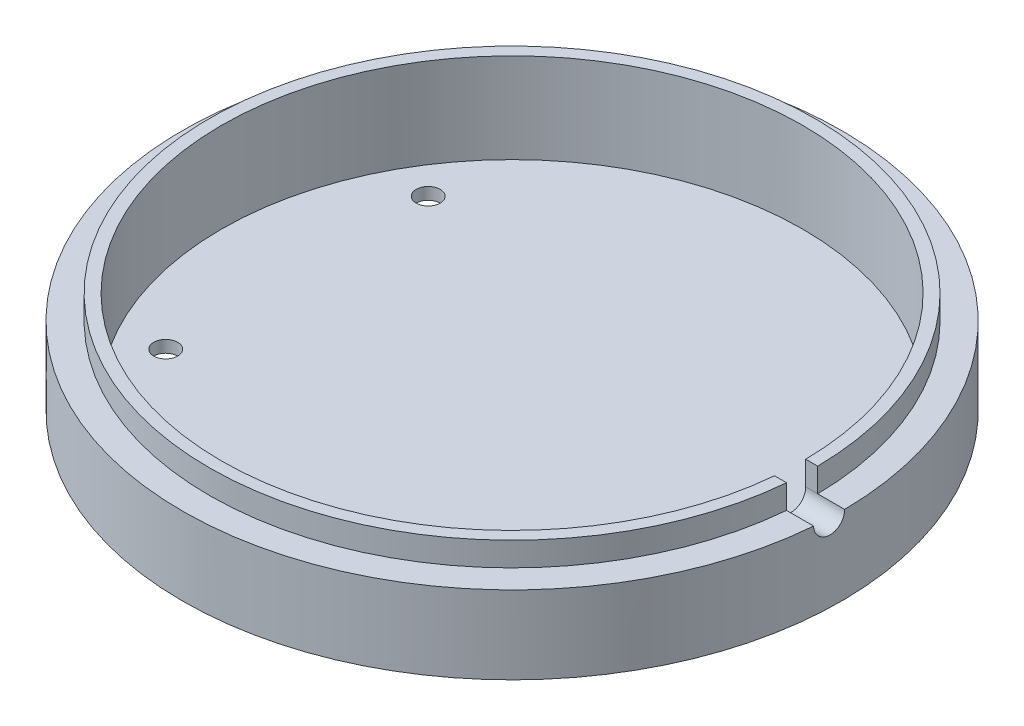
ISO-10303-21;
HEADER;
FILE_DESCRIPTION(('STEP AP214'),'2;1');
FILE_NAME('part.step','',(''),(''),'','','');
FILE_SCHEMA(('AUTOMOTIVE_DESIGN { 1 0 10303 214 1 1 1 1 }'));
ENDSEC;
DATA;
#1=APPLICATION_CONTEXT('core data for automotive mechanical design processes');
#2=APPLICATION_PROTOCOL_DEFINITION('international standard','automotive_design',2000,#1);
#3=PRODUCT_CONTEXT('',#1,'mechanical');
#4=PRODUCT('Part','Part','',(#3));
#5=PRODUCT_RELATED_PRODUCT_CATEGORY('part','',(#4));
#6=PRODUCT_DEFINITION_FORMATION('','',#4);
#7=PRODUCT_DEFINITION_CONTEXT('part definition',#1,'design');
#8=PRODUCT_DEFINITION('design','',#6,#7);
#9=PRODUCT_DEFINITION_SHAPE('','',#8);
#10=(LENGTH_UNIT() NAMED_UNIT(*) SI_UNIT(.MILLI.,.METRE.));
#11=(NAMED_UNIT(*) PLANE_ANGLE_UNIT() SI_UNIT($,.RADIAN.));
#12=(NAMED_UNIT(*) SI_UNIT($,.STERADIAN.) SOLID_ANGLE_UNIT());
#13=UNCERTAINTY_MEASURE_WITH_UNIT(LENGTH_MEASURE(1.E-05),#10,'distance_accuracy_value','');
#14=(GEOMETRIC_REPRESENTATION_CONTEXT(3) GLOBAL_UNCERTAINTY_ASSIGNED_CONTEXT((#13)) GLOBAL_UNIT_ASSIGNED_CONTEXT((#10,
#11,#12)) REPRESENTATION_CONTEXT('',''));
#15=CARTESIAN_POINT('',(0.,0.,0.));
#16=DIRECTION('',(0.,0.,1.));
#17=DIRECTION('',(1.,0.,0.));
#18=AXIS2_PLACEMENT_3D('',#15,#16,#17);
#19=CARTESIAN_POINT('',(0.,17.,0.));
#20=DIRECTION('',(0.,-1.,0.));
#21=DIRECTION('',(0.,0.,-1.));
#22=AXIS2_PLACEMENT_3D('',#19,#20,#21);
#23=CYLINDRICAL_SURFACE('',#22,50.5);
#24=DIRECTION('',(0.,-1.,0.));
#25=VECTOR('',#24,1.);
#26=CARTESIAN_POINT('',(50.4975246918104,17.,-0.500000000000002));
#27=LINE('',#26,#25);
#28=CARTESIAN_POINT('',(50.4975246918104,17.,-0.500000000000002));
#29=VERTEX_POINT('',#28);
#30=CARTESIAN_POINT('',(50.4975246918104,13.,-0.500000000000002));
#31=VERTEX_POINT('',#30);
#32=EDGE_CURVE('E106',#29,#31,#27,.T.);
#33=ORIENTED_EDGE('',*,*,#32,.T.);
#34=CARTESIAN_POINT('',(0.,13.,0.));
#35=DIRECTION('',(0.,1.,0.));
#36=DIRECTION('',(0.,0.,1.));
#37=AXIS2_PLACEMENT_3D('',#34,#35,#36);
#38=CIRCLE('',#37,50.5);
#39=CARTESIAN_POINT('',(50.2991053598372,13.,4.5));
#40=VERTEX_POINT('',#39);
#41=EDGE_CURVE('E119',#31,#40,#38,.T.);
#42=ORIENTED_EDGE('',*,*,#41,.T.);
#43=DIRECTION('',(0.,-1.,0.));
#44=VECTOR('',#43,1.);
#45=CARTESIAN_POINT('',(50.2991053598372,17.,4.5));
#46=LINE('',#45,#44);
#47=CARTESIAN_POINT('',(50.2991053598372,17.,4.5));
#48=VERTEX_POINT('',#47);
#49=EDGE_CURVE('E122',#40,#48,#46,.F.);
#50=ORIENTED_EDGE('',*,*,#49,.T.);
#51=CARTESIAN_POINT('',(0.,17.,0.));
#52=DIRECTION('',(0.,1.,0.));
#53=DIRECTION('',(0.,0.,1.));
#54=AXIS2_PLACEMENT_3D('',#51,#52,#53);
#55=CIRCLE('',#54,50.5);
#56=EDGE_CURVE('E121',#29,#48,#55,.T.);
#57=ORIENTED_EDGE('',*,*,#56,.F.);
#58=EDGE_LOOP('',(#33,#42,#50,#57));
#59=FACE_BOUND('',#58,.T.);
#60=ADVANCED_FACE('F36',(#59),#23,.T.);
#61=CARTESIAN_POINT('',(0.,2.,0.));
#62=DIRECTION('',(0.,1.,0.));
#63=DIRECTION('',(0.,0.,1.));
#64=AXIS2_PLACEMENT_3D('',#61,#62,#63);
#65=CYLINDRICAL_SURFACE('',#64,48.5);
#66=CARTESIAN_POINT('',(0.,2.,0.));
#67=DIRECTION('',(0.,1.,0.));
#68=DIRECTION('',(0.,0.,1.));
#69=AXIS2_PLACEMENT_3D('',#66,#67,#68);
#70=CIRCLE('',#69,48.5);
#71=CARTESIAN_POINT('',(0.,2.,48.5));
#72=VERTEX_POINT('',#71);
#73=EDGE_CURVE('E203',#72,#72,#70,.T.);
#74=ORIENTED_EDGE('',*,*,#73,.F.);
#75=EDGE_LOOP('',(#74));
#76=FACE_BOUND('',#75,.T.);
#77=DIRECTION('',(0.,1.,0.));
#78=VECTOR('',#77,1.);
#79=CARTESIAN_POINT('',(48.4974226119286,2.,-0.500000000000002));
#80=LINE('',#79,#78);
#81=CARTESIAN_POINT('',(48.4974226119286,17.,-0.500000000000002));
#82=VERTEX_POINT('',#81);
#83=CARTESIAN_POINT('',(48.4974226119286,13.,-0.500000000000002));
#84=VERTEX_POINT('',#83);
#85=EDGE_CURVE('E52',#82,#84,#80,.F.);
#86=ORIENTED_EDGE('',*,*,#85,.F.);
#87=CARTESIAN_POINT('',(0.,17.,0.));
#88=DIRECTION('',(0.,1.,0.));
#89=DIRECTION('',(0.,0.,1.));
#90=AXIS2_PLACEMENT_3D('',#87,#88,#89);
#91=CIRCLE('',#90,48.5);
#92=CARTESIAN_POINT('',(48.2907858705985,17.,4.5));
#93=VERTEX_POINT('',#92);
#94=EDGE_CURVE('E202',#82,#93,#91,.T.);
#95=ORIENTED_EDGE('',*,*,#94,.T.);
#96=DIRECTION('',(0.,1.,0.));
#97=VECTOR('',#96,1.);
#98=CARTESIAN_POINT('',(48.2907858705985,2.,4.5));
#99=LINE('',#98,#97);
#100=CARTESIAN_POINT('',(48.2907858705985,13.,4.5));
#101=VERTEX_POINT('',#100);
#102=EDGE_CURVE('E209',#101,#93,#99,.T.);
#103=ORIENTED_EDGE('',*,*,#102,.F.);
#104=CARTESIAN_POINT('',(48.2907858705985,13.,4.5));
#105=CARTESIAN_POINT('',(48.2907869983494,13.1400458171869,4.49999376397492));
#106=CARTESIAN_POINT('',(48.2918907021441,13.2801910099482,4.48819215089214));
#107=CARTESIAN_POINT('',(48.2962265607347,13.5566077401989,4.4412873276228));
#108=CARTESIAN_POINT('',(48.299461222655,13.6928745173943,4.40615666985574));
#109=CARTESIAN_POINT('',(48.30781305381,13.9574830838289,4.31362296534251));
#110=CARTESIAN_POINT('',(48.3129291088612,14.0858295111654,4.25623309966852));
#111=CARTESIAN_POINT('',(48.3246649170977,14.3310271215299,4.12084400911396));
#112=CARTESIAN_POINT('',(48.3312843306607,14.4478808923225,4.04284943837562));
#113=CARTESIAN_POINT('',(48.3455727644471,14.6671466057018,3.86823785388425));
#114=CARTESIAN_POINT('',(48.3532444122863,14.769521048206,3.77157396480461));
#115=CARTESIAN_POINT('',(48.3690986986214,14.9566145053684,3.56247969951368));
#116=CARTESIAN_POINT('',(48.3772813654191,15.0413325410319,3.45004844962752));
#117=CARTESIAN_POINT('',(48.3936565181206,15.1909744777779,3.21220200678276));
#118=CARTESIAN_POINT('',(48.4018489525332,15.2558345914832,3.08674667068886));
#119=CARTESIAN_POINT('',(48.4177319582093,15.3635543242681,2.82669160765621));
#120=CARTESIAN_POINT('',(48.4254225292327,15.4064139328293,2.69209187634552));
#121=CARTESIAN_POINT('',(48.4399051936473,15.4689043706511,2.417534835683));
#122=CARTESIAN_POINT('',(48.4466971541605,15.4885317679564,2.27757673792359));
#123=CARTESIAN_POINT('',(48.4591022764614,15.5039616585219,1.99630167778583));
#124=CARTESIAN_POINT('',(48.4647154547101,15.4997644845005,1.85498473441174));
#125=CARTESIAN_POINT('',(48.4746109420872,15.4676743516801,1.5753210531184));
#126=CARTESIAN_POINT('',(48.4788960209758,15.4398311669001,1.43696870154054));
#127=CARTESIAN_POINT('',(48.4861492064929,15.3612883557515,1.16687538695754));
#128=CARTESIAN_POINT('',(48.4891173235441,15.3105889102779,1.03513437163639));
#129=CARTESIAN_POINT('',(48.4938564158521,15.1878654257406,0.782227629154967));
#130=CARTESIAN_POINT('',(48.495629286958,15.115875419098,0.661045421218322));
#131=CARTESIAN_POINT('',(48.498206741385,14.9525810694077,0.432468418288963));
#132=CARTESIAN_POINT('',(48.499011324808,14.8612767283949,0.32507362184364));
#133=CARTESIAN_POINT('',(48.4999346579205,14.6619410320731,0.12711908176177));
#134=CARTESIAN_POINT('',(48.5000533864411,14.5539091605753,0.0365598578379977));
#135=CARTESIAN_POINT('',(48.499906157839,14.3241840867754,-0.125151211783195));
#136=CARTESIAN_POINT('',(48.4996401995591,14.2024908433771,-0.196302999096772));
#137=CARTESIAN_POINT('',(48.4990004965028,13.948819025278,-0.317217340452529));
#138=CARTESIAN_POINT('',(48.4986266894845,13.8168345434546,-0.36696750170044));
#139=CARTESIAN_POINT('',(48.4979864937392,13.5463870187929,-0.443606993328551));
#140=CARTESIAN_POINT('',(48.4977201050525,13.4079239735362,-0.470496315174723));
#141=CARTESIAN_POINT('',(48.4974182723465,13.1284282204978,-0.500653081529819));
#142=CARTESIAN_POINT('',(48.4973828618745,12.9873951424285,-0.503917094716511));
#143=CARTESIAN_POINT('',(48.4975584254694,12.7067828935153,-0.486721434199493));
#144=CARTESIAN_POINT('',(48.4977693996442,12.567203723308,-0.466261750110578));
#145=CARTESIAN_POINT('',(48.4983427516081,12.2934673149327,-0.402200996684137));
#146=CARTESIAN_POINT('',(48.4987051232031,12.1593098551962,-0.358600874056131));
#147=CARTESIAN_POINT('',(48.4993887585098,11.900218142056,-0.249497259290456));
#148=CARTESIAN_POINT('',(48.4997100221737,11.7752838993615,-0.183993741721003));
#149=CARTESIAN_POINT('',(48.5000474021985,11.5381788853034,-0.0329385307565904));
#150=CARTESIAN_POINT('',(48.5000635036592,11.4260087374432,0.0526141413801727));
#151=CARTESIAN_POINT('',(48.4994910988645,11.2176245498922,0.241336413439971));
#152=CARTESIAN_POINT('',(48.4989025938076,11.1214104785715,0.344505978440134));
#153=CARTESIAN_POINT('',(48.4968287410508,10.9476978141345,0.565495577012816));
#154=CARTESIAN_POINT('',(48.4953436597369,10.8701936715919,0.683311250755987));
#155=CARTESIAN_POINT('',(48.4912346809443,10.7360639585669,0.93026297259272));
#156=CARTESIAN_POINT('',(48.4886107914092,10.679438242453,1.05939894171694));
#157=CARTESIAN_POINT('',(48.4820730240634,10.5886917872186,1.32523528226841));
#158=CARTESIAN_POINT('',(48.4781598905006,10.5545580980456,1.46193125170266));
#159=CARTESIAN_POINT('',(48.4690092607255,10.5096950340537,1.73906758683945));
#160=CARTESIAN_POINT('',(48.4637717613087,10.498965715867,1.87950796160161));
#161=CARTESIAN_POINT('',(48.4520717499067,10.5011919939973,2.16020446790712));
#162=CARTESIAN_POINT('',(48.4456087518019,10.5141570068547,2.3004605040222));
#163=CARTESIAN_POINT('',(48.4316983596991,10.5633976107184,2.57676891696635));
#164=CARTESIAN_POINT('',(48.4242509511942,10.5996735452789,2.71282123181034));
#165=CARTESIAN_POINT('',(48.4087193758759,10.694588252759,2.97715748209569));
#166=CARTESIAN_POINT('',(48.4006339657292,10.753271591844,3.1054253419594));
#167=CARTESIAN_POINT('',(48.3843021994849,10.8913281673662,3.35028000325933));
#168=CARTESIAN_POINT('',(48.3760558472265,10.9707009108185,3.46686708293237));
#169=CARTESIAN_POINT('',(48.3599101143469,11.148048116964,3.68525774724829));
#170=CARTESIAN_POINT('',(48.3520113195286,11.2460526076055,3.78703699279143));
#171=CARTESIAN_POINT('',(48.3371102229767,11.4578507391222,3.9727165698393));
#172=CARTESIAN_POINT('',(48.3301081358122,11.5716481454915,4.05661262533356));
#173=CARTESIAN_POINT('',(48.3175076680898,11.81170309031,4.20403864436552));
#174=CARTESIAN_POINT('',(48.3119083742691,11.9379524471318,4.26758186578422));
#175=CARTESIAN_POINT('',(48.3025281377223,12.1992990127922,4.37247933629053));
#176=CARTESIAN_POINT('',(48.2987450062006,12.334385347175,4.41386030179198));
#177=CARTESIAN_POINT('',(48.29428496795,12.5586043713275,4.46232763393178));
#178=CARTESIAN_POINT('',(48.2929767974885,12.646269120631,4.4764364071059));
#179=CARTESIAN_POINT('',(48.2912268928844,12.8226092891764,4.4952745515513));
#180=CARTESIAN_POINT('',(48.2907851561984,12.9112847054506,4.50000395035577));
#181=CARTESIAN_POINT('',(48.2907858705985,13.,4.5));
#182=B_SPLINE_CURVE_WITH_KNOTS('',3,(#104,#105,#106,#107,#108,#109,#110,#111,#112,#113,#114,
#115,#116,#117,#118,#119,#120,#121,#122,#123,#124,#125,#126,#127,#128,#129,#130,#131,#132,#133,
#134,#135,#136,#137,#138,#139,#140,#141,#142,#143,#144,#145,#146,#147,#148,#149,#150,#151,#152,
#153,#154,#155,#156,#157,#158,#159,#160,#161,#162,#163,#164,#165,#166,#167,#168,#169,#170,#171,
#172,#173,#174,#175,#176,#177,#178,#179,#180,#181),.UNSPECIFIED.,.T.,.F.,(4,2,2,2,2,2,2,2,2,2,2,
2,2,2,2,2,2,2,2,2,2,2,2,2,2,2,2,2,2,2,2,2,2,2,2,2,2,2,4),(0.,0.419812985383906,
0.840120775190917,1.26018005347148,1.68014453075716,2.10117750384078,2.5222338157302,
2.94462878283616,3.36702395189101,3.78948151106725,4.21193317048901,4.6334977818766,
5.05505905686491,5.47595008584213,5.89684107047528,6.31774504582275,6.73865028737149,
7.15979893068439,7.5809477312134,8.00215769785337,8.42336784888087,8.84456076890713,
9.26575417797741,9.68696815277783,10.1081812925938,10.5292693452863,10.9503544607408,
11.3711969190864,11.7920403957547,12.213051159333,12.6340681278752,13.0559268573373,
13.4777755357113,13.9003099423644,14.3229452672459,14.7453047239898,15.1671538773262,
15.4330950009672,15.6990353439358),.UNSPECIFIED.);
#183=EDGE_CURVE('E149',#84,#101,#182,.T.);
#184=ORIENTED_EDGE('',*,*,#183,.F.);
#185=EDGE_LOOP('',(#86,#95,#103,#184));
#186=FACE_BOUND('',#185,.T.);
#187=ADVANCED_FACE('F157',(#76,#186),#65,.F.);
#188=CARTESIAN_POINT('',(0.,17.,0.));
#189=DIRECTION('',(0.,1.,0.));
#190=DIRECTION('',(0.,0.,1.));
#191=AXIS2_PLACEMENT_3D('',#188,#189,#190);
#192=PLANE('',#191);
#193=ORIENTED_EDGE('',*,*,#94,.F.);
#194=DIRECTION('',(1.,0.,0.));
#195=VECTOR('',#194,1.);
#196=CARTESIAN_POINT('',(0.,17.,-0.500000000000002));
#197=LINE('',#196,#195);
#198=EDGE_CURVE('E212',#82,#29,#197,.T.);
#199=ORIENTED_EDGE('',*,*,#198,.T.);
#200=ORIENTED_EDGE('',*,*,#56,.T.);
#201=DIRECTION('',(-1.,0.,0.));
#202=VECTOR('',#201,1.);
#203=CARTESIAN_POINT('',(0.,17.,4.5));
#204=LINE('',#203,#202);
#205=EDGE_CURVE('E213',#48,#93,#204,.T.);
#206=ORIENTED_EDGE('',*,*,#205,.T.);
#207=EDGE_LOOP('',(#193,#199,#200,#206));
#208=FACE_BOUND('',#207,.T.);
#209=ADVANCED_FACE('F165',(#208),#192,.T.);
#210=CARTESIAN_POINT('',(56.,13.,2.));
#211=DIRECTION('',(-1.,0.,0.));
#212=DIRECTION('',(0.,0.,1.));
#213=AXIS2_PLACEMENT_3D('',#210,#211,#212);
#214=CYLINDRICAL_SURFACE('',#213,2.5);
#215=DIRECTION('',(-1.,0.,0.));
#216=VECTOR('',#215,1.);
#217=CARTESIAN_POINT('',(56.,13.,-0.500000000000002));
#218=LINE('',#217,#216);
#219=CARTESIAN_POINT('',(54.9977272257682,13.,-0.500000000000002));
#220=VERTEX_POINT('',#219);
#221=EDGE_CURVE('E125',#31,#220,#218,.F.);
#222=ORIENTED_EDGE('',*,*,#221,.F.);
#223=DIRECTION('',(-1.,0.,0.));
#224=VECTOR('',#223,1.);
#225=CARTESIAN_POINT('',(55.001,13.,-0.500000000000002));
#226=LINE('',#225,#224);
#227=EDGE_CURVE('E103',#31,#84,#226,.T.);
#228=ORIENTED_EDGE('',*,*,#227,.T.);
#229=ORIENTED_EDGE('',*,*,#183,.T.);
#230=DIRECTION('',(-1.,0.,0.));
#231=VECTOR('',#230,1.);
#232=CARTESIAN_POINT('',(55.001,13.,4.5));
#233=LINE('',#232,#231);
#234=EDGE_CURVE('E112',#40,#101,#233,.T.);
#235=ORIENTED_EDGE('',*,*,#234,.F.);
#236=DIRECTION('',(-1.,0.,0.));
#237=VECTOR('',#236,1.);
#238=CARTESIAN_POINT('',(56.,13.,4.5));
#239=LINE('',#238,#237);
#240=CARTESIAN_POINT('',(54.8155999693518,13.,4.5));
#241=VERTEX_POINT('',#240);
#242=EDGE_CURVE('E132',#241,#40,#239,.T.);
#243=ORIENTED_EDGE('',*,*,#242,.F.);
#244=CARTESIAN_POINT('',(54.8155999693518,13.,4.5));
#245=CARTESIAN_POINT('',(54.8155983995871,12.9298297064675,4.50000686898044));
#246=CARTESIAN_POINT('',(54.8158424708288,12.8596627290745,4.49704571114808));
#247=CARTESIAN_POINT('',(54.8168102127968,12.7198326668636,4.48524049891385));
#248=CARTESIAN_POINT('',(54.817533855794,12.6501695531472,4.4763967846463));
#249=CARTESIAN_POINT('',(54.8194482712985,12.511893308751,4.45288930525375));
#250=CARTESIAN_POINT('',(54.8206386579611,12.4432793593086,4.43823034732211));
#251=CARTESIAN_POINT('',(54.8234623014956,12.3075513393883,4.40321324488677));
#252=CARTESIAN_POINT('',(54.8250955538865,12.2404372537414,4.38285515805018));
#253=CARTESIAN_POINT('',(54.8306186752923,12.0420000555667,4.31340330285218));
#254=CARTESIAN_POINT('',(54.8351328519614,11.9135165507092,4.25592074868602));
#255=CARTESIAN_POINT('',(54.8454876976989,11.6681199865616,4.12032400604888));
#256=CARTESIAN_POINT('',(54.8513281602884,11.5512051303029,4.04221302874706));
#257=CARTESIAN_POINT('',(54.8639319033103,11.331895926801,3.86738298659584));
#258=CARTESIAN_POINT('',(54.8706969246008,11.2295297333087,3.77062867374373));
#259=CARTESIAN_POINT('',(54.8846778692196,11.0424664608524,3.56133585574425));
#260=CARTESIAN_POINT('',(54.8918938646935,10.9577722184538,3.4487948214746));
#261=CARTESIAN_POINT('',(54.9063282778711,10.8082614167667,3.21081585107867));
#262=CARTESIAN_POINT('',(54.9135466584752,10.7434938934282,3.08534709817857));
#263=CARTESIAN_POINT('',(54.927539858995,10.6359607438593,2.82529691658091));
#264=CARTESIAN_POINT('',(54.9343147061477,10.5931937654913,2.69071604848275));
#265=CARTESIAN_POINT('',(54.9470719937661,10.5308776725196,2.41622598188404));
#266=CARTESIAN_POINT('',(54.9530543300848,10.5113316067874,2.27631608617846));
#267=CARTESIAN_POINT('',(54.9639803254768,10.4960436611623,1.99515819421601));
#268=CARTESIAN_POINT('',(54.9689239704275,10.5003021049075,1.85391017979258));
#269=CARTESIAN_POINT('',(54.9776408652268,10.5324955513434,1.57433731308931));
#270=CARTESIAN_POINT('',(54.981416024597,10.5603916438506,1.43600803954293));
#271=CARTESIAN_POINT('',(54.9878054829992,10.6390301187327,1.16597601403474));
#272=CARTESIAN_POINT('',(54.9904197940988,10.6897722636034,1.03427319320114));
#273=CARTESIAN_POINT('',(54.9945942782886,10.8125918179653,0.781402844326326));
#274=CARTESIAN_POINT('',(54.9961557220252,10.8846433586514,0.660222771480109));
#275=CARTESIAN_POINT('',(54.9984249148587,11.0480584929222,0.431670323347613));
#276=CARTESIAN_POINT('',(54.9991327047969,11.1394211623602,0.324297287711839));
#277=CARTESIAN_POINT('',(54.9999439314467,11.338855132503,0.126412340330451));
#278=CARTESIAN_POINT('',(55.0000474330046,11.4469246391163,0.0358986204176465));
#279=CARTESIAN_POINT('',(54.9999158777237,11.6767601403725,-0.125741007440721));
#280=CARTESIAN_POINT('',(54.9996807141877,11.7985304403338,-0.196860796893223));
#281=CARTESIAN_POINT('',(54.9991156728593,12.0523860507389,-0.317720039174873));
#282=CARTESIAN_POINT('',(54.9987856957761,12.1844820683789,-0.367436941367662));
#283=CARTESIAN_POINT('',(54.9982220247451,12.4550443456375,-0.443915443368607));
#284=CARTESIAN_POINT('',(54.9979881857985,12.5935006591629,-0.470711679356618));
#285=CARTESIAN_POINT('',(54.997813076319,12.7774087930417,-0.490473167770539));
#286=CARTESIAN_POINT('',(54.9977810379513,12.8218913510113,-0.494047607667849));
#287=CARTESIAN_POINT('',(54.9977381353444,12.9109098931291,-0.498807772845912));
#288=CARTESIAN_POINT('',(54.997727235937,12.9554456649861,-0.499997465672938));
#289=CARTESIAN_POINT('',(54.9977272257682,13.,-0.500000000000002));
#290=B_SPLINE_CURVE_WITH_KNOTS('',3,(#244,#245,#246,#247,#248,#249,#250,#251,#252,#253,#254,
#255,#256,#257,#258,#259,#260,#261,#262,#263,#264,#265,#266,#267,#268,#269,#270,#271,#272,#273,
#274,#275,#276,#277,#278,#279,#280,#281,#282,#283,#284,#285,#286,#287,#288,#289),.UNSPECIFIED.,
.F.,.F.,(4,2,2,2,2,2,2,2,2,2,2,2,2,2,2,2,2,2,2,2,2,2,4),(0.,0.210442048238931,0.420871929600584,
0.631128219576992,0.841382382134809,1.26169399365941,1.68194021497366,2.10298891175693,
2.52410514013121,2.94624951819372,3.36836794846858,3.79054179614422,4.21272138356788,
4.63420736376111,5.05568896235081,5.47666098376657,5.89761286384909,6.31851957067453,
6.73955891400426,7.16104079595895,7.58188463173058,7.71571748361011,7.84932748996267),.UNSPECIFIED.);
#291=EDGE_CURVE('E128',#241,#220,#290,.T.);
#292=ORIENTED_EDGE('',*,*,#291,.T.);
#293=EDGE_LOOP('',(#222,#228,#229,#235,#243,#292));
#294=FACE_BOUND('',#293,.T.);
#295=ADVANCED_FACE('F126',(#294),#214,.F.);
#296=CARTESIAN_POINT('',(0.,13.,0.));
#297=DIRECTION('',(0.,-1.,0.));
#298=DIRECTION('',(0.,0.,-1.));
#299=AXIS2_PLACEMENT_3D('',#296,#297,#298);
#300=CYLINDRICAL_SURFACE('',#299,55.);
#301=CARTESIAN_POINT('',(0.,0.,0.));
#302=DIRECTION('',(0.,1.,0.));
#303=DIRECTION('',(0.,0.,1.));
#304=AXIS2_PLACEMENT_3D('',#301,#302,#303);
#305=CIRCLE('',#304,55.);
#306=CARTESIAN_POINT('',(0.,0.,55.));
#307=VERTEX_POINT('',#306);
#308=EDGE_CURVE('E142',#307,#307,#305,.T.);
#309=ORIENTED_EDGE('',*,*,#308,.T.);
#310=EDGE_LOOP('',(#309));
#311=FACE_BOUND('',#310,.T.);
#312=ORIENTED_EDGE('',*,*,#291,.F.);
#313=CARTESIAN_POINT('',(0.,13.,0.));
#314=DIRECTION('',(0.,1.,0.));
#315=DIRECTION('',(0.,0.,1.));
#316=AXIS2_PLACEMENT_3D('',#313,#314,#315);
#317=CIRCLE('',#316,55.);
#318=EDGE_CURVE('E137',#220,#241,#317,.T.);
#319=ORIENTED_EDGE('',*,*,#318,.F.);
#320=EDGE_LOOP('',(#312,#319));
#321=FACE_BOUND('',#320,.T.);
#322=ADVANCED_FACE('F38',(#311,#321),#300,.T.);
#323=CARTESIAN_POINT('',(0.,13.,0.));
#324=DIRECTION('',(0.,1.,0.));
#325=DIRECTION('',(0.,0.,1.));
#326=AXIS2_PLACEMENT_3D('',#323,#324,#325);
#327=PLANE('',#326);
#328=ORIENTED_EDGE('',*,*,#41,.F.);
#329=ORIENTED_EDGE('',*,*,#221,.T.);
#330=ORIENTED_EDGE('',*,*,#318,.T.);
#331=ORIENTED_EDGE('',*,*,#242,.T.);
#332=EDGE_LOOP('',(#328,#329,#330,#331));
#333=FACE_BOUND('',#332,.T.);
#334=ADVANCED_FACE('F135',(#333),#327,.T.);
#335=CARTESIAN_POINT('',(0.,0.,0.));
#336=DIRECTION('',(0.,1.,0.));
#337=DIRECTION('',(0.,0.,1.));
#338=AXIS2_PLACEMENT_3D('',#335,#336,#337);
#339=PLANE('',#338);
#340=ORIENTED_EDGE('',*,*,#308,.F.);
#341=EDGE_LOOP('',(#340));
#342=FACE_BOUND('',#341,.T.);
#343=CARTESIAN_POINT('',(36.,0.,22.));
#344=DIRECTION('',(0.,1.,0.));
#345=DIRECTION('',(0.,0.,1.));
#346=AXIS2_PLACEMENT_3D('',#343,#344,#345);
#347=CIRCLE('',#346,2.);
#348=CARTESIAN_POINT('',(36.,0.,24.));
#349=VERTEX_POINT('',#348);
#350=EDGE_CURVE('E190',#349,#349,#347,.T.);
#351=ORIENTED_EDGE('',*,*,#350,.T.);
#352=EDGE_LOOP('',(#351));
#353=FACE_BOUND('',#352,.T.);
#354=CARTESIAN_POINT('',(-36.,0.,-22.));
#355=DIRECTION('',(0.,1.,0.));
#356=DIRECTION('',(0.,0.,1.));
#357=AXIS2_PLACEMENT_3D('',#354,#355,#356);
#358=CIRCLE('',#357,2.);
#359=CARTESIAN_POINT('',(-36.,0.,-20.));
#360=VERTEX_POINT('',#359);
#361=EDGE_CURVE('E193',#360,#360,#358,.T.);
#362=ORIENTED_EDGE('',*,*,#361,.T.);
#363=EDGE_LOOP('',(#362));
#364=FACE_BOUND('',#363,.T.);
#365=CARTESIAN_POINT('',(-35.8,0.,22.));
#366=DIRECTION('',(0.,1.,0.));
#367=DIRECTION('',(0.,0.,1.));
#368=AXIS2_PLACEMENT_3D('',#365,#366,#367);
#369=CIRCLE('',#368,2.);
#370=CARTESIAN_POINT('',(-35.8,0.,24.));
#371=VERTEX_POINT('',#370);
#372=EDGE_CURVE('E196',#371,#371,#369,.T.);
#373=ORIENTED_EDGE('',*,*,#372,.T.);
#374=EDGE_LOOP('',(#373));
#375=FACE_BOUND('',#374,.T.);
#376=CARTESIAN_POINT('',(36.,0.,-22.));
#377=DIRECTION('',(0.,1.,0.));
#378=DIRECTION('',(0.,0.,1.));
#379=AXIS2_PLACEMENT_3D('',#376,#377,#378);
#380=CIRCLE('',#379,2.);
#381=CARTESIAN_POINT('',(36.,0.,-20.));
#382=VERTEX_POINT('',#381);
#383=EDGE_CURVE('E199',#382,#382,#380,.T.);
#384=ORIENTED_EDGE('',*,*,#383,.T.);
#385=EDGE_LOOP('',(#384));
#386=FACE_BOUND('',#385,.T.);
#387=ADVANCED_FACE('F262',(#342,#353,#364,#375,#386),#339,.F.);
#388=CARTESIAN_POINT('',(0.,2.,0.));
#389=DIRECTION('',(0.,1.,0.));
#390=DIRECTION('',(0.,0.,1.));
#391=AXIS2_PLACEMENT_3D('',#388,#389,#390);
#392=PLANE('',#391);
#393=DIRECTION('',(0.,0.,-1.));
#394=VECTOR('',#393,1.);
#395=CARTESIAN_POINT('',(40.3308376566258,2.,0.));
#396=LINE('',#395,#394);
#397=CARTESIAN_POINT('',(40.3308376566258,2.,4.07797949128508));
#398=VERTEX_POINT('',#397);
#399=CARTESIAN_POINT('',(40.3308376566258,2.,-3.30155452738268));
#400=VERTEX_POINT('',#399);
#401=EDGE_CURVE('E11',#398,#400,#396,.T.);
#402=ORIENTED_EDGE('',*,*,#401,.F.);
#403=DIRECTION('',(1.,0.,0.));
#404=VECTOR('',#403,1.);
#405=CARTESIAN_POINT('',(0.,2.,4.07797949128508));
#406=LINE('',#405,#404);
#407=CARTESIAN_POINT('',(34.05656444491,2.,4.07797949128508));
#408=VERTEX_POINT('',#407);
#409=EDGE_CURVE('E45',#408,#398,#406,.T.);
#410=ORIENTED_EDGE('',*,*,#409,.F.);
#411=DIRECTION('',(0.,0.,1.));
#412=VECTOR('',#411,1.);
#413=CARTESIAN_POINT('',(34.05656444491,2.,0.));
#414=LINE('',#413,#412);
#415=CARTESIAN_POINT('',(34.05656444491,2.,-3.30155452738268));
#416=VERTEX_POINT('',#415);
#417=EDGE_CURVE('E140',#416,#408,#414,.T.);
#418=ORIENTED_EDGE('',*,*,#417,.F.);
#419=DIRECTION('',(-1.,0.,0.));
#420=VECTOR('',#419,1.);
#421=CARTESIAN_POINT('',(0.,2.,-3.30155452738268));
#422=LINE('',#421,#420);
#423=EDGE_CURVE('E136',#400,#416,#422,.T.);
#424=ORIENTED_EDGE('',*,*,#423,.F.);
#425=EDGE_LOOP('',(#402,#410,#418,#424));
#426=FACE_BOUND('',#425,.T.);
#427=CARTESIAN_POINT('',(36.,2.,-22.));
#428=DIRECTION('',(0.,1.,0.));
#429=DIRECTION('',(0.,0.,1.));
#430=AXIS2_PLACEMENT_3D('',#427,#428,#429);
#431=CIRCLE('',#430,2.);
#432=CARTESIAN_POINT('',(36.,2.,-20.));
#433=VERTEX_POINT('',#432);
#434=EDGE_CURVE('E177',#433,#433,#431,.T.);
#435=ORIENTED_EDGE('',*,*,#434,.F.);
#436=EDGE_LOOP('',(#435));
#437=FACE_BOUND('',#436,.T.);
#438=CARTESIAN_POINT('',(-35.8,2.,22.));
#439=DIRECTION('',(0.,1.,0.));
#440=DIRECTION('',(0.,0.,1.));
#441=AXIS2_PLACEMENT_3D('',#438,#439,#440);
#442=CIRCLE('',#441,2.);
#443=CARTESIAN_POINT('',(-35.8,2.,24.));
#444=VERTEX_POINT('',#443);
#445=EDGE_CURVE('E183',#444,#444,#442,.T.);
#446=ORIENTED_EDGE('',*,*,#445,.F.);
#447=EDGE_LOOP('',(#446));
#448=FACE_BOUND('',#447,.T.);
#449=CARTESIAN_POINT('',(-36.,2.,-22.));
#450=DIRECTION('',(0.,1.,0.));
#451=DIRECTION('',(0.,0.,1.));
#452=AXIS2_PLACEMENT_3D('',#449,#450,#451);
#453=CIRCLE('',#452,2.);
#454=CARTESIAN_POINT('',(-36.,2.,-20.));
#455=VERTEX_POINT('',#454);
#456=EDGE_CURVE('E179',#455,#455,#453,.T.);
#457=ORIENTED_EDGE('',*,*,#456,.F.);
#458=EDGE_LOOP('',(#457));
#459=FACE_BOUND('',#458,.T.);
#460=CARTESIAN_POINT('',(36.,2.,22.));
#461=DIRECTION('',(0.,1.,0.));
#462=DIRECTION('',(0.,0.,1.));
#463=AXIS2_PLACEMENT_3D('',#460,#461,#462);
#464=CIRCLE('',#463,2.);
#465=CARTESIAN_POINT('',(36.,2.,24.));
#466=VERTEX_POINT('',#465);
#467=EDGE_CURVE('E182',#466,#466,#464,.T.);
#468=ORIENTED_EDGE('',*,*,#467,.F.);
#469=EDGE_LOOP('',(#468));
#470=FACE_BOUND('',#469,.T.);
#471=ORIENTED_EDGE('',*,*,#73,.T.);
#472=EDGE_LOOP('',(#471));
#473=FACE_BOUND('',#472,.T.);
#474=ADVANCED_FACE('F258',(#426,#437,#448,#459,#470,#473),#392,.T.);
#475=CARTESIAN_POINT('',(36.,-13.,22.));
#476=DIRECTION('',(0.,1.,0.));
#477=DIRECTION('',(0.,0.,1.));
#478=AXIS2_PLACEMENT_3D('',#475,#476,#477);
#479=CYLINDRICAL_SURFACE('',#478,2.);
#480=ORIENTED_EDGE('',*,*,#467,.T.);
#481=EDGE_LOOP('',(#480));
#482=FACE_BOUND('',#481,.T.);
#483=ORIENTED_EDGE('',*,*,#350,.F.);
#484=EDGE_LOOP('',(#483));
#485=FACE_BOUND('',#484,.T.);
#486=ADVANCED_FACE('F261',(#482,#485),#479,.F.);
#487=CARTESIAN_POINT('',(-36.,-13.,-22.));
#488=DIRECTION('',(0.,1.,0.));
#489=DIRECTION('',(0.,0.,1.));
#490=AXIS2_PLACEMENT_3D('',#487,#488,#489);
#491=CYLINDRICAL_SURFACE('',#490,2.);
#492=ORIENTED_EDGE('',*,*,#456,.T.);
#493=EDGE_LOOP('',(#492));
#494=FACE_BOUND('',#493,.T.);
#495=ORIENTED_EDGE('',*,*,#361,.F.);
#496=EDGE_LOOP('',(#495));
#497=FACE_BOUND('',#496,.T.);
#498=ADVANCED_FACE('F168',(#494,#497),#491,.F.);
#499=CARTESIAN_POINT('',(-35.8,-13.,22.));
#500=DIRECTION('',(0.,1.,0.));
#501=DIRECTION('',(0.,0.,1.));
#502=AXIS2_PLACEMENT_3D('',#499,#500,#501);
#503=CYLINDRICAL_SURFACE('',#502,2.);
#504=ORIENTED_EDGE('',*,*,#445,.T.);
#505=EDGE_LOOP('',(#504));
#506=FACE_BOUND('',#505,.T.);
#507=ORIENTED_EDGE('',*,*,#372,.F.);
#508=EDGE_LOOP('',(#507));
#509=FACE_BOUND('',#508,.T.);
#510=ADVANCED_FACE('F299',(#506,#509),#503,.F.);
#511=CARTESIAN_POINT('',(36.,-13.,-22.));
#512=DIRECTION('',(0.,1.,0.));
#513=DIRECTION('',(0.,0.,1.));
#514=AXIS2_PLACEMENT_3D('',#511,#512,#513);
#515=CYLINDRICAL_SURFACE('',#514,2.);
#516=ORIENTED_EDGE('',*,*,#434,.T.);
#517=EDGE_LOOP('',(#516));
#518=FACE_BOUND('',#517,.T.);
#519=ORIENTED_EDGE('',*,*,#383,.F.);
#520=EDGE_LOOP('',(#519));
#521=FACE_BOUND('',#520,.T.);
#522=ADVANCED_FACE('F297',(#518,#521),#515,.F.);
#523=CARTESIAN_POINT('',(40.3308376566258,0.,4.07797949128508));
#524=DIRECTION('',(1.,0.,0.));
#525=DIRECTION('',(0.,0.,-1.));
#526=AXIS2_PLACEMENT_3D('',#523,#524,#525);
#527=PLANE('',#526);
#528=DIRECTION('',(0.,1.,0.));
#529=VECTOR('',#528,1.);
#530=CARTESIAN_POINT('',(40.3308376566258,0.,4.07797949128508));
#531=LINE('',#530,#529);
#532=CARTESIAN_POINT('',(40.3308376566258,2.01,4.07797949128508));
#533=VERTEX_POINT('',#532);
#534=EDGE_CURVE('E155',#398,#533,#531,.T.);
#535=ORIENTED_EDGE('',*,*,#534,.F.);
#536=ORIENTED_EDGE('',*,*,#401,.T.);
#537=DIRECTION('',(0.,1.,0.));
#538=VECTOR('',#537,1.);
#539=CARTESIAN_POINT('',(40.3308376566258,0.,-3.30155452738268));
#540=LINE('',#539,#538);
#541=CARTESIAN_POINT('',(40.3308376566258,2.01,-3.30155452738268));
#542=VERTEX_POINT('',#541);
#543=EDGE_CURVE('E234',#400,#542,#540,.T.);
#544=ORIENTED_EDGE('',*,*,#543,.T.);
#545=DIRECTION('',(0.,0.,-1.));
#546=VECTOR('',#545,1.);
#547=CARTESIAN_POINT('',(40.3308376566258,2.01,4.07797949128508));
#548=LINE('',#547,#546);
#549=EDGE_CURVE('E222',#533,#542,#548,.T.);
#550=ORIENTED_EDGE('',*,*,#549,.F.);
#551=EDGE_LOOP('',(#535,#536,#544,#550));
#552=FACE_BOUND('',#551,.T.);
#553=ADVANCED_FACE('F166',(#552),#527,.T.);
#554=CARTESIAN_POINT('',(40.3308376566258,0.,4.07797949128508));
#555=DIRECTION('',(0.,0.,1.));
#556=DIRECTION('',(1.,0.,0.));
#557=AXIS2_PLACEMENT_3D('',#554,#555,#556);
#558=PLANE('',#557);
#559=DIRECTION('',(0.,1.,0.));
#560=VECTOR('',#559,1.);
#561=CARTESIAN_POINT('',(34.05656444491,0.,4.07797949128508));
#562=LINE('',#561,#560);
#563=CARTESIAN_POINT('',(34.05656444491,2.01,4.07797949128508));
#564=VERTEX_POINT('',#563);
#565=EDGE_CURVE('E236',#408,#564,#562,.T.);
#566=ORIENTED_EDGE('',*,*,#565,.F.);
#567=ORIENTED_EDGE('',*,*,#409,.T.);
#568=ORIENTED_EDGE('',*,*,#534,.T.);
#569=DIRECTION('',(1.,0.,0.));
#570=VECTOR('',#569,1.);
#571=CARTESIAN_POINT('',(40.3308376566258,2.01,4.07797949128508));
#572=LINE('',#571,#570);
#573=EDGE_CURVE('E231',#564,#533,#572,.T.);
#574=ORIENTED_EDGE('',*,*,#573,.F.);
#575=EDGE_LOOP('',(#566,#567,#568,#574));
#576=FACE_BOUND('',#575,.T.);
#577=ADVANCED_FACE('F254',(#576),#558,.T.);
#578=CARTESIAN_POINT('',(34.05656444491,0.,4.07797949128508));
#579=DIRECTION('',(-1.,0.,0.));
#580=DIRECTION('',(0.,0.,1.));
#581=AXIS2_PLACEMENT_3D('',#578,#579,#580);
#582=PLANE('',#581);
#583=DIRECTION('',(0.,1.,0.));
#584=VECTOR('',#583,1.);
#585=CARTESIAN_POINT('',(34.05656444491,0.,-3.30155452738268));
#586=LINE('',#585,#584);
#587=CARTESIAN_POINT('',(34.05656444491,2.01,-3.30155452738268));
#588=VERTEX_POINT('',#587);
#589=EDGE_CURVE('E238',#416,#588,#586,.T.);
#590=ORIENTED_EDGE('',*,*,#589,.F.);
#591=ORIENTED_EDGE('',*,*,#417,.T.);
#592=ORIENTED_EDGE('',*,*,#565,.T.);
#593=DIRECTION('',(0.,0.,1.));
#594=VECTOR('',#593,1.);
#595=CARTESIAN_POINT('',(34.05656444491,2.01,4.07797949128508));
#596=LINE('',#595,#594);
#597=EDGE_CURVE('E228',#588,#564,#596,.T.);
#598=ORIENTED_EDGE('',*,*,#597,.F.);
#599=EDGE_LOOP('',(#590,#591,#592,#598));
#600=FACE_BOUND('',#599,.T.);
#601=ADVANCED_FACE('F257',(#600),#582,.T.);
#602=CARTESIAN_POINT('',(40.3308376566258,0.,-3.30155452738268));
#603=DIRECTION('',(0.,0.,-1.));
#604=DIRECTION('',(-1.,0.,0.));
#605=AXIS2_PLACEMENT_3D('',#602,#603,#604);
#606=PLANE('',#605);
#607=ORIENTED_EDGE('',*,*,#543,.F.);
#608=ORIENTED_EDGE('',*,*,#423,.T.);
#609=ORIENTED_EDGE('',*,*,#589,.T.);
#610=DIRECTION('',(-1.,0.,0.));
#611=VECTOR('',#610,1.);
#612=CARTESIAN_POINT('',(40.3308376566258,2.01,-3.30155452738268));
#613=LINE('',#612,#611);
#614=EDGE_CURVE('E225',#542,#588,#613,.T.);
#615=ORIENTED_EDGE('',*,*,#614,.F.);
#616=EDGE_LOOP('',(#607,#608,#609,#615));
#617=FACE_BOUND('',#616,.T.);
#618=ADVANCED_FACE('F246',(#617),#606,.T.);
#619=CARTESIAN_POINT('',(0.,2.01,0.));
#620=DIRECTION('',(0.,1.,0.));
#621=DIRECTION('',(0.,0.,1.));
#622=AXIS2_PLACEMENT_3D('',#619,#620,#621);
#623=PLANE('',#622);
#624=ORIENTED_EDGE('',*,*,#549,.T.);
#625=ORIENTED_EDGE('',*,*,#614,.T.);
#626=ORIENTED_EDGE('',*,*,#597,.T.);
#627=ORIENTED_EDGE('',*,*,#573,.T.);
#628=EDGE_LOOP('',(#624,#625,#626,#627));
#629=FACE_BOUND('',#628,.T.);
#630=ADVANCED_FACE('F250',(#629),#623,.T.);
#631=CARTESIAN_POINT('',(55.001,13.,4.5));
#632=DIRECTION('',(0.,0.,-1.));
#633=DIRECTION('',(-1.,0.,0.));
#634=AXIS2_PLACEMENT_3D('',#631,#632,#633);
#635=PLANE('',#634);
#636=ORIENTED_EDGE('',*,*,#102,.T.);
#637=ORIENTED_EDGE('',*,*,#205,.F.);
#638=ORIENTED_EDGE('',*,*,#49,.F.);
#639=ORIENTED_EDGE('',*,*,#234,.T.);
#640=EDGE_LOOP('',(#636,#637,#638,#639));
#641=FACE_BOUND('',#640,.T.);
#642=ADVANCED_FACE('F383',(#641),#635,.T.);
#643=CARTESIAN_POINT('',(55.001,13.,-0.500000000000002));
#644=DIRECTION('',(0.,0.,1.));
#645=DIRECTION('',(1.,0.,0.));
#646=AXIS2_PLACEMENT_3D('',#643,#644,#645);
#647=PLANE('',#646);
#648=ORIENTED_EDGE('',*,*,#85,.T.);
#649=ORIENTED_EDGE('',*,*,#227,.F.);
#650=ORIENTED_EDGE('',*,*,#32,.F.);
#651=ORIENTED_EDGE('',*,*,#198,.F.);
#652=EDGE_LOOP('',(#648,#649,#650,#651));
#653=FACE_BOUND('',#652,.T.);
#654=ADVANCED_FACE('F105',(#653),#647,.T.);
#655=CLOSED_SHELL('',(#60,#187,#209,#295,#322,#334,#387,#474,#486,#498,#510,#522,#553,#577,#601,
#618,#630,#642,#654));
#656=MANIFOLD_SOLID_BREP('B2',#655);
#657=ADVANCED_BREP_SHAPE_REPRESENTATION('',(#18,#656),#14);
#658=SHAPE_DEFINITION_REPRESENTATION(#9,#657);
ENDSEC;
END-ISO-10303-21;
